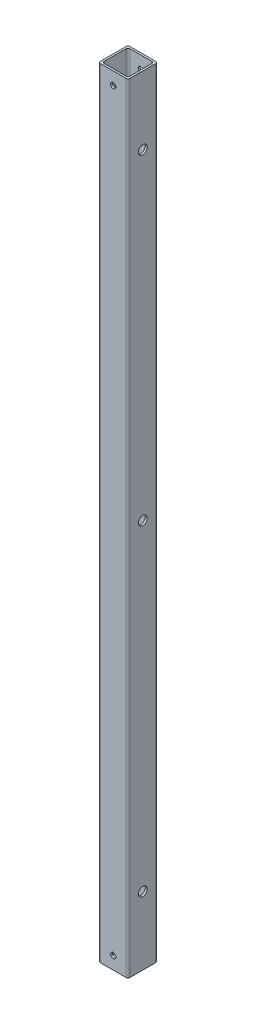
ISO-10303-21;
HEADER;
FILE_DESCRIPTION(('STEP AP214'),'2;1');
FILE_NAME('part.step','',(''),(''),'','','');
FILE_SCHEMA(('AUTOMOTIVE_DESIGN { 1 0 10303 214 1 1 1 1 }'));
ENDSEC;
DATA;
#1=APPLICATION_CONTEXT('core data for automotive mechanical design processes');
#2=APPLICATION_PROTOCOL_DEFINITION('international standard','automotive_design',2000,#1);
#3=PRODUCT_CONTEXT('',#1,'mechanical');
#4=PRODUCT('Part','Part','',(#3));
#5=PRODUCT_RELATED_PRODUCT_CATEGORY('part','',(#4));
#6=PRODUCT_DEFINITION_FORMATION('','',#4);
#7=PRODUCT_DEFINITION_CONTEXT('part definition',#1,'design');
#8=PRODUCT_DEFINITION('design','',#6,#7);
#9=PRODUCT_DEFINITION_SHAPE('','',#8);
#10=(LENGTH_UNIT() NAMED_UNIT(*) SI_UNIT(.MILLI.,.METRE.));
#11=(NAMED_UNIT(*) PLANE_ANGLE_UNIT() SI_UNIT($,.RADIAN.));
#12=(NAMED_UNIT(*) SI_UNIT($,.STERADIAN.) SOLID_ANGLE_UNIT());
#13=UNCERTAINTY_MEASURE_WITH_UNIT(LENGTH_MEASURE(1.E-05),#10,'distance_accuracy_value','');
#14=(GEOMETRIC_REPRESENTATION_CONTEXT(3) GLOBAL_UNCERTAINTY_ASSIGNED_CONTEXT((#13)) GLOBAL_UNIT_ASSIGNED_CONTEXT((#10,
#11,#12)) REPRESENTATION_CONTEXT('',''));
#15=CARTESIAN_POINT('',(0.,0.,0.));
#16=DIRECTION('',(0.,0.,1.));
#17=DIRECTION('',(1.,0.,0.));
#18=AXIS2_PLACEMENT_3D('',#15,#16,#17);
#19=CARTESIAN_POINT('',(0.,508.,0.));
#20=DIRECTION('',(0.,-1.,0.));
#21=DIRECTION('',(0.,0.,-1.));
#22=AXIS2_PLACEMENT_3D('',#19,#20,#21);
#23=PLANE('',#22);
#24=DIRECTION('',(0.,0.,1.));
#25=VECTOR('',#24,1.);
#26=CARTESIAN_POINT('',(-9.652,508.,9.652));
#27=LINE('',#26,#25);
#28=CARTESIAN_POINT('',(-9.652,508.,-8.382));
#29=VERTEX_POINT('',#28);
#30=CARTESIAN_POINT('',(-9.652,508.,8.382));
#31=VERTEX_POINT('',#30);
#32=EDGE_CURVE('E180',#29,#31,#27,.T.);
#33=ORIENTED_EDGE('',*,*,#32,.T.);
#34=CARTESIAN_POINT('',(-8.382,508.,8.382));
#35=DIRECTION('',(0.,-1.,0.));
#36=DIRECTION('',(0.,0.,-1.));
#37=AXIS2_PLACEMENT_3D('',#34,#35,#36);
#38=CIRCLE('',#37,1.27);
#39=CARTESIAN_POINT('',(-8.382,508.,9.652));
#40=VERTEX_POINT('',#39);
#41=EDGE_CURVE('E222',#31,#40,#38,.F.);
#42=ORIENTED_EDGE('',*,*,#41,.T.);
#43=DIRECTION('',(1.,0.,0.));
#44=VECTOR('',#43,1.);
#45=CARTESIAN_POINT('',(-9.652,508.,9.652));
#46=LINE('',#45,#44);
#47=CARTESIAN_POINT('',(8.382,508.,9.652));
#48=VERTEX_POINT('',#47);
#49=EDGE_CURVE('E175',#40,#48,#46,.T.);
#50=ORIENTED_EDGE('',*,*,#49,.T.);
#51=CARTESIAN_POINT('',(8.382,508.,8.382));
#52=DIRECTION('',(0.,-1.,0.));
#53=DIRECTION('',(0.,0.,-1.));
#54=AXIS2_PLACEMENT_3D('',#51,#52,#53);
#55=CIRCLE('',#54,1.27);
#56=CARTESIAN_POINT('',(9.652,508.,8.382));
#57=VERTEX_POINT('',#56);
#58=EDGE_CURVE('E217',#48,#57,#55,.F.);
#59=ORIENTED_EDGE('',*,*,#58,.T.);
#60=DIRECTION('',(0.,0.,-1.));
#61=VECTOR('',#60,1.);
#62=CARTESIAN_POINT('',(9.652,508.,9.652));
#63=LINE('',#62,#61);
#64=CARTESIAN_POINT('',(9.652,508.,-8.382));
#65=VERTEX_POINT('',#64);
#66=EDGE_CURVE('E313',#57,#65,#63,.T.);
#67=ORIENTED_EDGE('',*,*,#66,.T.);
#68=CARTESIAN_POINT('',(8.382,508.,-8.382));
#69=DIRECTION('',(0.,-1.,0.));
#70=DIRECTION('',(0.,0.,-1.));
#71=AXIS2_PLACEMENT_3D('',#68,#69,#70);
#72=CIRCLE('',#71,1.27);
#73=CARTESIAN_POINT('',(8.382,508.,-9.652));
#74=VERTEX_POINT('',#73);
#75=EDGE_CURVE('E58',#65,#74,#72,.F.);
#76=ORIENTED_EDGE('',*,*,#75,.T.);
#77=DIRECTION('',(-1.,0.,0.));
#78=VECTOR('',#77,1.);
#79=CARTESIAN_POINT('',(-9.652,508.,-9.652));
#80=LINE('',#79,#78);
#81=CARTESIAN_POINT('',(-8.382,508.,-9.652));
#82=VERTEX_POINT('',#81);
#83=EDGE_CURVE('E315',#74,#82,#80,.T.);
#84=ORIENTED_EDGE('',*,*,#83,.T.);
#85=CARTESIAN_POINT('',(-8.382,508.,-8.382));
#86=DIRECTION('',(0.,-1.,0.));
#87=DIRECTION('',(0.,0.,-1.));
#88=AXIS2_PLACEMENT_3D('',#85,#86,#87);
#89=CIRCLE('',#88,1.27);
#90=EDGE_CURVE('E220',#82,#29,#89,.F.);
#91=ORIENTED_EDGE('',*,*,#90,.T.);
#92=EDGE_LOOP('',(#33,#42,#50,#59,#67,#76,#84,#91));
#93=FACE_BOUND('',#92,.T.);
#94=DIRECTION('',(1.,0.,0.));
#95=VECTOR('',#94,1.);
#96=CARTESIAN_POINT('',(-8.382,508.,8.382));
#97=LINE('',#96,#95);
#98=CARTESIAN_POINT('',(-7.112,508.,8.382));
#99=VERTEX_POINT('',#98);
#100=CARTESIAN_POINT('',(7.112,508.,8.382));
#101=VERTEX_POINT('',#100);
#102=EDGE_CURVE('E296',#99,#101,#97,.T.);
#103=ORIENTED_EDGE('',*,*,#102,.F.);
#104=CARTESIAN_POINT('',(-7.112,508.,7.112));
#105=DIRECTION('',(0.,-1.,0.));
#106=DIRECTION('',(0.,0.,-1.));
#107=AXIS2_PLACEMENT_3D('',#104,#105,#106);
#108=CIRCLE('',#107,1.27);
#109=CARTESIAN_POINT('',(-8.382,508.,7.112));
#110=VERTEX_POINT('',#109);
#111=EDGE_CURVE('E11',#99,#110,#108,.T.);
#112=ORIENTED_EDGE('',*,*,#111,.T.);
#113=DIRECTION('',(0.,0.,1.));
#114=VECTOR('',#113,1.);
#115=CARTESIAN_POINT('',(-8.382,508.,8.382));
#116=LINE('',#115,#114);
#117=CARTESIAN_POINT('',(-8.382,508.,-7.11199999999999));
#118=VERTEX_POINT('',#117);
#119=EDGE_CURVE('E304',#118,#110,#116,.T.);
#120=ORIENTED_EDGE('',*,*,#119,.F.);
#121=CARTESIAN_POINT('',(-7.112,508.,-7.112));
#122=DIRECTION('',(0.,-1.,0.));
#123=DIRECTION('',(0.,0.,-1.));
#124=AXIS2_PLACEMENT_3D('',#121,#122,#123);
#125=CIRCLE('',#124,1.27);
#126=CARTESIAN_POINT('',(-7.112,508.,-8.382));
#127=VERTEX_POINT('',#126);
#128=EDGE_CURVE('E235',#118,#127,#125,.T.);
#129=ORIENTED_EDGE('',*,*,#128,.T.);
#130=DIRECTION('',(-1.,0.,0.));
#131=VECTOR('',#130,1.);
#132=CARTESIAN_POINT('',(-8.382,508.,-8.382));
#133=LINE('',#132,#131);
#134=CARTESIAN_POINT('',(7.112,508.,-8.382));
#135=VERTEX_POINT('',#134);
#136=EDGE_CURVE('E302',#135,#127,#133,.T.);
#137=ORIENTED_EDGE('',*,*,#136,.F.);
#138=CARTESIAN_POINT('',(7.112,508.,-7.112));
#139=DIRECTION('',(0.,-1.,0.));
#140=DIRECTION('',(0.,0.,-1.));
#141=AXIS2_PLACEMENT_3D('',#138,#139,#140);
#142=CIRCLE('',#141,1.27);
#143=CARTESIAN_POINT('',(8.382,508.,-7.11199999999999));
#144=VERTEX_POINT('',#143);
#145=EDGE_CURVE('E160',#135,#144,#142,.T.);
#146=ORIENTED_EDGE('',*,*,#145,.T.);
#147=DIRECTION('',(0.,0.,-1.));
#148=VECTOR('',#147,1.);
#149=CARTESIAN_POINT('',(8.382,508.,8.382));
#150=LINE('',#149,#148);
#151=CARTESIAN_POINT('',(8.382,508.,7.112));
#152=VERTEX_POINT('',#151);
#153=EDGE_CURVE('E299',#152,#144,#150,.T.);
#154=ORIENTED_EDGE('',*,*,#153,.F.);
#155=CARTESIAN_POINT('',(7.112,508.,7.112));
#156=DIRECTION('',(0.,-1.,0.));
#157=DIRECTION('',(0.,0.,-1.));
#158=AXIS2_PLACEMENT_3D('',#155,#156,#157);
#159=CIRCLE('',#158,1.27);
#160=EDGE_CURVE('E161',#152,#101,#159,.T.);
#161=ORIENTED_EDGE('',*,*,#160,.T.);
#162=EDGE_LOOP('',(#103,#112,#120,#129,#137,#146,#154,#161));
#163=FACE_BOUND('',#162,.T.);
#164=ADVANCED_FACE('F34',(#93,#163),#23,.F.);
#165=CARTESIAN_POINT('',(0.,0.,0.));
#166=DIRECTION('',(0.,-1.,0.));
#167=DIRECTION('',(0.,0.,-1.));
#168=AXIS2_PLACEMENT_3D('',#165,#166,#167);
#169=PLANE('',#168);
#170=DIRECTION('',(1.,0.,0.));
#171=VECTOR('',#170,1.);
#172=CARTESIAN_POINT('',(-9.652,0.,9.652));
#173=LINE('',#172,#171);
#174=CARTESIAN_POINT('',(-8.382,0.,9.652));
#175=VERTEX_POINT('',#174);
#176=CARTESIAN_POINT('',(8.382,0.,9.652));
#177=VERTEX_POINT('',#176);
#178=EDGE_CURVE('E183',#175,#177,#173,.T.);
#179=ORIENTED_EDGE('',*,*,#178,.F.);
#180=CARTESIAN_POINT('',(-8.382,0.,8.382));
#181=DIRECTION('',(0.,-1.,0.));
#182=DIRECTION('',(0.,0.,-1.));
#183=AXIS2_PLACEMENT_3D('',#180,#181,#182);
#184=CIRCLE('',#183,1.27);
#185=CARTESIAN_POINT('',(-9.652,0.,8.382));
#186=VERTEX_POINT('',#185);
#187=EDGE_CURVE('E210',#175,#186,#184,.T.);
#188=ORIENTED_EDGE('',*,*,#187,.T.);
#189=DIRECTION('',(0.,0.,1.));
#190=VECTOR('',#189,1.);
#191=CARTESIAN_POINT('',(-9.652,0.,9.652));
#192=LINE('',#191,#190);
#193=CARTESIAN_POINT('',(-9.652,0.,-8.382));
#194=VERTEX_POINT('',#193);
#195=EDGE_CURVE('E322',#194,#186,#192,.T.);
#196=ORIENTED_EDGE('',*,*,#195,.F.);
#197=CARTESIAN_POINT('',(-8.382,0.,-8.382));
#198=DIRECTION('',(0.,-1.,0.));
#199=DIRECTION('',(0.,0.,-1.));
#200=AXIS2_PLACEMENT_3D('',#197,#198,#199);
#201=CIRCLE('',#200,1.27);
#202=CARTESIAN_POINT('',(-8.382,0.,-9.652));
#203=VERTEX_POINT('',#202);
#204=EDGE_CURVE('E208',#194,#203,#201,.T.);
#205=ORIENTED_EDGE('',*,*,#204,.T.);
#206=DIRECTION('',(-1.,0.,0.));
#207=VECTOR('',#206,1.);
#208=CARTESIAN_POINT('',(-9.652,0.,-9.652));
#209=LINE('',#208,#207);
#210=CARTESIAN_POINT('',(8.382,0.,-9.652));
#211=VERTEX_POINT('',#210);
#212=EDGE_CURVE('E321',#211,#203,#209,.T.);
#213=ORIENTED_EDGE('',*,*,#212,.F.);
#214=CARTESIAN_POINT('',(8.382,0.,-8.382));
#215=DIRECTION('',(0.,-1.,0.));
#216=DIRECTION('',(0.,0.,-1.));
#217=AXIS2_PLACEMENT_3D('',#214,#215,#216);
#218=CIRCLE('',#217,1.27);
#219=CARTESIAN_POINT('',(9.652,0.,-8.382));
#220=VERTEX_POINT('',#219);
#221=EDGE_CURVE('E206',#211,#220,#218,.T.);
#222=ORIENTED_EDGE('',*,*,#221,.T.);
#223=DIRECTION('',(0.,0.,-1.));
#224=VECTOR('',#223,1.);
#225=CARTESIAN_POINT('',(9.652,0.,9.652));
#226=LINE('',#225,#224);
#227=CARTESIAN_POINT('',(9.652,0.,8.382));
#228=VERTEX_POINT('',#227);
#229=EDGE_CURVE('E307',#228,#220,#226,.T.);
#230=ORIENTED_EDGE('',*,*,#229,.F.);
#231=CARTESIAN_POINT('',(8.382,0.,8.382));
#232=DIRECTION('',(0.,-1.,0.));
#233=DIRECTION('',(0.,0.,-1.));
#234=AXIS2_PLACEMENT_3D('',#231,#232,#233);
#235=CIRCLE('',#234,1.27);
#236=EDGE_CURVE('E204',#228,#177,#235,.T.);
#237=ORIENTED_EDGE('',*,*,#236,.T.);
#238=EDGE_LOOP('',(#179,#188,#196,#205,#213,#222,#230,#237));
#239=FACE_BOUND('',#238,.T.);
#240=DIRECTION('',(-1.,0.,0.));
#241=VECTOR('',#240,1.);
#242=CARTESIAN_POINT('',(-8.382,0.,-8.382));
#243=LINE('',#242,#241);
#244=CARTESIAN_POINT('',(7.112,0.,-8.382));
#245=VERTEX_POINT('',#244);
#246=CARTESIAN_POINT('',(-7.112,0.,-8.382));
#247=VERTEX_POINT('',#246);
#248=EDGE_CURVE('E153',#245,#247,#243,.T.);
#249=ORIENTED_EDGE('',*,*,#248,.T.);
#250=CARTESIAN_POINT('',(-7.112,0.,-7.112));
#251=DIRECTION('',(0.,-1.,0.));
#252=DIRECTION('',(0.,0.,-1.));
#253=AXIS2_PLACEMENT_3D('',#250,#251,#252);
#254=CIRCLE('',#253,1.27);
#255=CARTESIAN_POINT('',(-8.382,0.,-7.11199999999999));
#256=VERTEX_POINT('',#255);
#257=EDGE_CURVE('E233',#247,#256,#254,.F.);
#258=ORIENTED_EDGE('',*,*,#257,.T.);
#259=DIRECTION('',(0.,0.,1.));
#260=VECTOR('',#259,1.);
#261=CARTESIAN_POINT('',(-8.382,0.,8.382));
#262=LINE('',#261,#260);
#263=CARTESIAN_POINT('',(-8.382,0.,7.112));
#264=VERTEX_POINT('',#263);
#265=EDGE_CURVE('E171',#256,#264,#262,.T.);
#266=ORIENTED_EDGE('',*,*,#265,.T.);
#267=CARTESIAN_POINT('',(-7.112,0.,7.112));
#268=DIRECTION('',(0.,-1.,0.));
#269=DIRECTION('',(0.,0.,-1.));
#270=AXIS2_PLACEMENT_3D('',#267,#268,#269);
#271=CIRCLE('',#270,1.27);
#272=CARTESIAN_POINT('',(-7.112,0.,8.382));
#273=VERTEX_POINT('',#272);
#274=EDGE_CURVE('E43',#264,#273,#271,.F.);
#275=ORIENTED_EDGE('',*,*,#274,.T.);
#276=DIRECTION('',(1.,0.,0.));
#277=VECTOR('',#276,1.);
#278=CARTESIAN_POINT('',(-8.382,0.,8.382));
#279=LINE('',#278,#277);
#280=CARTESIAN_POINT('',(7.112,0.,8.382));
#281=VERTEX_POINT('',#280);
#282=EDGE_CURVE('E295',#273,#281,#279,.T.);
#283=ORIENTED_EDGE('',*,*,#282,.T.);
#284=CARTESIAN_POINT('',(7.112,0.,7.112));
#285=DIRECTION('',(0.,-1.,0.));
#286=DIRECTION('',(0.,0.,-1.));
#287=AXIS2_PLACEMENT_3D('',#284,#285,#286);
#288=CIRCLE('',#287,1.27);
#289=CARTESIAN_POINT('',(8.382,0.,7.112));
#290=VERTEX_POINT('',#289);
#291=EDGE_CURVE('E237',#281,#290,#288,.F.);
#292=ORIENTED_EDGE('',*,*,#291,.T.);
#293=DIRECTION('',(0.,0.,-1.));
#294=VECTOR('',#293,1.);
#295=CARTESIAN_POINT('',(8.382,0.,8.382));
#296=LINE('',#295,#294);
#297=CARTESIAN_POINT('',(8.382,0.,-7.11199999999999));
#298=VERTEX_POINT('',#297);
#299=EDGE_CURVE('E155',#290,#298,#296,.T.);
#300=ORIENTED_EDGE('',*,*,#299,.T.);
#301=CARTESIAN_POINT('',(7.112,0.,-7.112));
#302=DIRECTION('',(0.,-1.,0.));
#303=DIRECTION('',(0.,0.,-1.));
#304=AXIS2_PLACEMENT_3D('',#301,#302,#303);
#305=CIRCLE('',#304,1.27);
#306=EDGE_CURVE('E150',#298,#245,#305,.F.);
#307=ORIENTED_EDGE('',*,*,#306,.T.);
#308=EDGE_LOOP('',(#249,#258,#266,#275,#283,#292,#300,#307));
#309=FACE_BOUND('',#308,.T.);
#310=ADVANCED_FACE('F152',(#239,#309),#169,.T.);
#311=CARTESIAN_POINT('',(9.652,508.,9.652));
#312=DIRECTION('',(-1.,0.,0.));
#313=DIRECTION('',(0.,0.,1.));
#314=AXIS2_PLACEMENT_3D('',#311,#312,#313);
#315=PLANE('',#314);
#316=CARTESIAN_POINT('',(9.652,44.45,0.));
#317=DIRECTION('',(-1.,0.,0.));
#318=DIRECTION('',(0.,0.,1.));
#319=AXIS2_PLACEMENT_3D('',#316,#317,#318);
#320=CIRCLE('',#319,2.8956);
#321=CARTESIAN_POINT('',(9.652,44.45,2.8956));
#322=VERTEX_POINT('',#321);
#323=EDGE_CURVE('E255',#322,#322,#320,.T.);
#324=ORIENTED_EDGE('',*,*,#323,.T.);
#325=EDGE_LOOP('',(#324));
#326=FACE_BOUND('',#325,.T.);
#327=CARTESIAN_POINT('',(9.652,254.,0.));
#328=DIRECTION('',(-1.,0.,0.));
#329=DIRECTION('',(0.,0.,1.));
#330=AXIS2_PLACEMENT_3D('',#327,#328,#329);
#331=CIRCLE('',#330,2.8956);
#332=CARTESIAN_POINT('',(9.652,254.,2.8956));
#333=VERTEX_POINT('',#332);
#334=EDGE_CURVE('E251',#333,#333,#331,.T.);
#335=ORIENTED_EDGE('',*,*,#334,.T.);
#336=EDGE_LOOP('',(#335));
#337=FACE_BOUND('',#336,.T.);
#338=CARTESIAN_POINT('',(9.652,463.55,0.));
#339=DIRECTION('',(-1.,0.,0.));
#340=DIRECTION('',(0.,0.,1.));
#341=AXIS2_PLACEMENT_3D('',#338,#339,#340);
#342=CIRCLE('',#341,2.8956);
#343=CARTESIAN_POINT('',(9.652,463.55,2.8956));
#344=VERTEX_POINT('',#343);
#345=EDGE_CURVE('E246',#344,#344,#342,.T.);
#346=ORIENTED_EDGE('',*,*,#345,.T.);
#347=EDGE_LOOP('',(#346));
#348=FACE_BOUND('',#347,.T.);
#349=ORIENTED_EDGE('',*,*,#229,.T.);
#350=DIRECTION('',(0.,-1.,0.));
#351=VECTOR('',#350,1.);
#352=CARTESIAN_POINT('',(9.652,508.,-8.382));
#353=LINE('',#352,#351);
#354=EDGE_CURVE('E231',#220,#65,#353,.F.);
#355=ORIENTED_EDGE('',*,*,#354,.T.);
#356=ORIENTED_EDGE('',*,*,#66,.F.);
#357=DIRECTION('',(0.,-1.,0.));
#358=VECTOR('',#357,1.);
#359=CARTESIAN_POINT('',(9.652,508.,8.382));
#360=LINE('',#359,#358);
#361=EDGE_CURVE('E228',#57,#228,#360,.T.);
#362=ORIENTED_EDGE('',*,*,#361,.T.);
#363=EDGE_LOOP('',(#349,#355,#356,#362));
#364=FACE_BOUND('',#363,.T.);
#365=ADVANCED_FACE('F341',(#326,#337,#348,#364),#315,.F.);
#366=CARTESIAN_POINT('',(-9.652,508.,-9.652));
#367=DIRECTION('',(0.,0.,1.));
#368=DIRECTION('',(1.,0.,0.));
#369=AXIS2_PLACEMENT_3D('',#366,#367,#368);
#370=PLANE('',#369);
#371=CARTESIAN_POINT('',(0.,499.745,-9.652));
#372=DIRECTION('',(0.,0.,1.));
#373=DIRECTION('',(1.,0.,0.));
#374=AXIS2_PLACEMENT_3D('',#371,#372,#373);
#375=CIRCLE('',#374,1.7272);
#376=CARTESIAN_POINT('',(1.72720000000006,499.745,-9.652));
#377=VERTEX_POINT('',#376);
#378=EDGE_CURVE('E691',#377,#377,#375,.T.);
#379=ORIENTED_EDGE('',*,*,#378,.T.);
#380=EDGE_LOOP('',(#379));
#381=FACE_BOUND('',#380,.T.);
#382=CARTESIAN_POINT('',(0.,8.255,-9.652));
#383=DIRECTION('',(0.,0.,1.));
#384=DIRECTION('',(1.,0.,0.));
#385=AXIS2_PLACEMENT_3D('',#382,#383,#384);
#386=CIRCLE('',#385,1.7272);
#387=CARTESIAN_POINT('',(1.72720000000006,8.255,-9.652));
#388=VERTEX_POINT('',#387);
#389=EDGE_CURVE('E259',#388,#388,#386,.T.);
#390=ORIENTED_EDGE('',*,*,#389,.T.);
#391=EDGE_LOOP('',(#390));
#392=FACE_BOUND('',#391,.T.);
#393=ORIENTED_EDGE('',*,*,#212,.T.);
#394=DIRECTION('',(0.,-1.,0.));
#395=VECTOR('',#394,1.);
#396=CARTESIAN_POINT('',(-8.382,508.,-9.652));
#397=LINE('',#396,#395);
#398=EDGE_CURVE('E51',#203,#82,#397,.F.);
#399=ORIENTED_EDGE('',*,*,#398,.T.);
#400=ORIENTED_EDGE('',*,*,#83,.F.);
#401=DIRECTION('',(0.,-1.,0.));
#402=VECTOR('',#401,1.);
#403=CARTESIAN_POINT('',(8.382,508.,-9.652));
#404=LINE('',#403,#402);
#405=EDGE_CURVE('E224',#74,#211,#404,.T.);
#406=ORIENTED_EDGE('',*,*,#405,.T.);
#407=EDGE_LOOP('',(#393,#399,#400,#406));
#408=FACE_BOUND('',#407,.T.);
#409=ADVANCED_FACE('F348',(#381,#392,#408),#370,.F.);
#410=CARTESIAN_POINT('',(-9.652,508.,9.652));
#411=DIRECTION('',(1.,0.,0.));
#412=DIRECTION('',(0.,0.,-1.));
#413=AXIS2_PLACEMENT_3D('',#410,#411,#412);
#414=PLANE('',#413);
#415=CARTESIAN_POINT('',(-9.652,44.45,0.));
#416=DIRECTION('',(-1.,0.,0.));
#417=DIRECTION('',(0.,0.,1.));
#418=AXIS2_PLACEMENT_3D('',#415,#416,#417);
#419=CIRCLE('',#418,2.89559999999998);
#420=CARTESIAN_POINT('',(-9.652,44.45,2.89559999999998));
#421=VERTEX_POINT('',#420);
#422=EDGE_CURVE('E263',#421,#421,#419,.T.);
#423=ORIENTED_EDGE('',*,*,#422,.F.);
#424=EDGE_LOOP('',(#423));
#425=FACE_BOUND('',#424,.T.);
#426=CARTESIAN_POINT('',(-9.652,254.,0.));
#427=DIRECTION('',(-1.,0.,0.));
#428=DIRECTION('',(0.,0.,1.));
#429=AXIS2_PLACEMENT_3D('',#426,#427,#428);
#430=CIRCLE('',#429,2.8956);
#431=CARTESIAN_POINT('',(-9.652,254.,2.8956));
#432=VERTEX_POINT('',#431);
#433=EDGE_CURVE('E281',#432,#432,#430,.T.);
#434=ORIENTED_EDGE('',*,*,#433,.F.);
#435=EDGE_LOOP('',(#434));
#436=FACE_BOUND('',#435,.T.);
#437=CARTESIAN_POINT('',(-9.652,463.55,0.));
#438=DIRECTION('',(-1.,0.,0.));
#439=DIRECTION('',(0.,0.,1.));
#440=AXIS2_PLACEMENT_3D('',#437,#438,#439);
#441=CIRCLE('',#440,2.8956);
#442=CARTESIAN_POINT('',(-9.652,463.55,2.8956));
#443=VERTEX_POINT('',#442);
#444=EDGE_CURVE('E288',#443,#443,#441,.T.);
#445=ORIENTED_EDGE('',*,*,#444,.F.);
#446=EDGE_LOOP('',(#445));
#447=FACE_BOUND('',#446,.T.);
#448=ORIENTED_EDGE('',*,*,#195,.T.);
#449=DIRECTION('',(0.,-1.,0.));
#450=VECTOR('',#449,1.);
#451=CARTESIAN_POINT('',(-9.652,508.,8.382));
#452=LINE('',#451,#450);
#453=EDGE_CURVE('E215',#186,#31,#452,.F.);
#454=ORIENTED_EDGE('',*,*,#453,.T.);
#455=ORIENTED_EDGE('',*,*,#32,.F.);
#456=DIRECTION('',(0.,-1.,0.));
#457=VECTOR('',#456,1.);
#458=CARTESIAN_POINT('',(-9.652,508.,-8.382));
#459=LINE('',#458,#457);
#460=EDGE_CURVE('E212',#29,#194,#459,.T.);
#461=ORIENTED_EDGE('',*,*,#460,.T.);
#462=EDGE_LOOP('',(#448,#454,#455,#461));
#463=FACE_BOUND('',#462,.T.);
#464=ADVANCED_FACE('F354',(#425,#436,#447,#463),#414,.F.);
#465=CARTESIAN_POINT('',(-9.652,508.,9.652));
#466=DIRECTION('',(0.,0.,-1.));
#467=DIRECTION('',(-1.,0.,0.));
#468=AXIS2_PLACEMENT_3D('',#465,#466,#467);
#469=PLANE('',#468);
#470=CARTESIAN_POINT('',(0.,499.745,9.652));
#471=DIRECTION('',(0.,0.,1.));
#472=DIRECTION('',(1.,0.,0.));
#473=AXIS2_PLACEMENT_3D('',#470,#471,#472);
#474=CIRCLE('',#473,1.7272);
#475=CARTESIAN_POINT('',(1.72720000000006,499.745,9.652));
#476=VERTEX_POINT('',#475);
#477=EDGE_CURVE('E695',#476,#476,#474,.T.);
#478=ORIENTED_EDGE('',*,*,#477,.F.);
#479=EDGE_LOOP('',(#478));
#480=FACE_BOUND('',#479,.T.);
#481=CARTESIAN_POINT('',(0.,8.255,9.652));
#482=DIRECTION('',(0.,0.,1.));
#483=DIRECTION('',(1.,0.,0.));
#484=AXIS2_PLACEMENT_3D('',#481,#482,#483);
#485=CIRCLE('',#484,1.7272);
#486=CARTESIAN_POINT('',(1.72720000000006,8.255,9.652));
#487=VERTEX_POINT('',#486);
#488=EDGE_CURVE('E266',#487,#487,#485,.T.);
#489=ORIENTED_EDGE('',*,*,#488,.F.);
#490=EDGE_LOOP('',(#489));
#491=FACE_BOUND('',#490,.T.);
#492=ORIENTED_EDGE('',*,*,#49,.F.);
#493=DIRECTION('',(0.,-1.,0.));
#494=VECTOR('',#493,1.);
#495=CARTESIAN_POINT('',(-8.382,508.,9.652));
#496=LINE('',#495,#494);
#497=EDGE_CURVE('E201',#40,#175,#496,.T.);
#498=ORIENTED_EDGE('',*,*,#497,.T.);
#499=ORIENTED_EDGE('',*,*,#178,.T.);
#500=DIRECTION('',(0.,-1.,0.));
#501=VECTOR('',#500,1.);
#502=CARTESIAN_POINT('',(8.382,508.,9.652));
#503=LINE('',#502,#501);
#504=EDGE_CURVE('E199',#177,#48,#503,.F.);
#505=ORIENTED_EDGE('',*,*,#504,.T.);
#506=EDGE_LOOP('',(#492,#498,#499,#505));
#507=FACE_BOUND('',#506,.T.);
#508=ADVANCED_FACE('F332',(#480,#491,#507),#469,.F.);
#509=CARTESIAN_POINT('',(-8.382,508.,8.382));
#510=DIRECTION('',(0.,0.,-1.));
#511=DIRECTION('',(-1.,0.,0.));
#512=AXIS2_PLACEMENT_3D('',#509,#510,#511);
#513=PLANE('',#512);
#514=CARTESIAN_POINT('',(0.,499.745,8.382));
#515=DIRECTION('',(0.,0.,-1.));
#516=DIRECTION('',(-1.,0.,0.));
#517=AXIS2_PLACEMENT_3D('',#514,#515,#516);
#518=CIRCLE('',#517,1.7272);
#519=CARTESIAN_POINT('',(-1.72719999999993,499.745,8.382));
#520=VERTEX_POINT('',#519);
#521=EDGE_CURVE('E271',#520,#520,#518,.T.);
#522=ORIENTED_EDGE('',*,*,#521,.F.);
#523=EDGE_LOOP('',(#522));
#524=FACE_BOUND('',#523,.T.);
#525=CARTESIAN_POINT('',(0.,8.255,8.382));
#526=DIRECTION('',(0.,0.,-1.));
#527=DIRECTION('',(-1.,0.,0.));
#528=AXIS2_PLACEMENT_3D('',#525,#526,#527);
#529=CIRCLE('',#528,1.7272);
#530=CARTESIAN_POINT('',(-1.72719999999993,8.255,8.382));
#531=VERTEX_POINT('',#530);
#532=EDGE_CURVE('E258',#531,#531,#529,.T.);
#533=ORIENTED_EDGE('',*,*,#532,.F.);
#534=EDGE_LOOP('',(#533));
#535=FACE_BOUND('',#534,.T.);
#536=ORIENTED_EDGE('',*,*,#102,.T.);
#537=DIRECTION('',(0.,-1.,0.));
#538=VECTOR('',#537,1.);
#539=CARTESIAN_POINT('',(7.112,0.,8.382));
#540=LINE('',#539,#538);
#541=EDGE_CURVE('E192',#101,#281,#540,.T.);
#542=ORIENTED_EDGE('',*,*,#541,.T.);
#543=ORIENTED_EDGE('',*,*,#282,.F.);
#544=DIRECTION('',(0.,-1.,0.));
#545=VECTOR('',#544,1.);
#546=CARTESIAN_POINT('',(-7.112,508.,8.382));
#547=LINE('',#546,#545);
#548=EDGE_CURVE('E190',#273,#99,#547,.F.);
#549=ORIENTED_EDGE('',*,*,#548,.T.);
#550=EDGE_LOOP('',(#536,#542,#543,#549));
#551=FACE_BOUND('',#550,.T.);
#552=ADVANCED_FACE('F375',(#524,#535,#551),#513,.T.);
#553=CARTESIAN_POINT('',(8.382,508.,8.382));
#554=DIRECTION('',(-1.,0.,0.));
#555=DIRECTION('',(0.,0.,1.));
#556=AXIS2_PLACEMENT_3D('',#553,#554,#555);
#557=PLANE('',#556);
#558=CARTESIAN_POINT('',(8.382,44.45,0.));
#559=DIRECTION('',(-1.,0.,0.));
#560=DIRECTION('',(0.,0.,1.));
#561=AXIS2_PLACEMENT_3D('',#558,#559,#560);
#562=CIRCLE('',#561,2.89559999999999);
#563=CARTESIAN_POINT('',(8.382,44.45,2.89559999999999));
#564=VERTEX_POINT('',#563);
#565=EDGE_CURVE('E254',#564,#564,#562,.T.);
#566=ORIENTED_EDGE('',*,*,#565,.F.);
#567=EDGE_LOOP('',(#566));
#568=FACE_BOUND('',#567,.T.);
#569=CARTESIAN_POINT('',(8.382,254.,0.));
#570=DIRECTION('',(-1.,0.,0.));
#571=DIRECTION('',(0.,0.,1.));
#572=AXIS2_PLACEMENT_3D('',#569,#570,#571);
#573=CIRCLE('',#572,2.8956);
#574=CARTESIAN_POINT('',(8.382,254.,2.8956));
#575=VERTEX_POINT('',#574);
#576=EDGE_CURVE('E250',#575,#575,#573,.T.);
#577=ORIENTED_EDGE('',*,*,#576,.F.);
#578=EDGE_LOOP('',(#577));
#579=FACE_BOUND('',#578,.T.);
#580=CARTESIAN_POINT('',(8.382,463.55,0.));
#581=DIRECTION('',(-1.,0.,0.));
#582=DIRECTION('',(0.,0.,1.));
#583=AXIS2_PLACEMENT_3D('',#580,#581,#582);
#584=CIRCLE('',#583,2.8956);
#585=CARTESIAN_POINT('',(8.382,463.55,2.8956));
#586=VERTEX_POINT('',#585);
#587=EDGE_CURVE('E245',#586,#586,#584,.T.);
#588=ORIENTED_EDGE('',*,*,#587,.F.);
#589=EDGE_LOOP('',(#588));
#590=FACE_BOUND('',#589,.T.);
#591=ORIENTED_EDGE('',*,*,#299,.F.);
#592=DIRECTION('',(0.,-1.,0.));
#593=VECTOR('',#592,1.);
#594=CARTESIAN_POINT('',(8.382,508.,7.112));
#595=LINE('',#594,#593);
#596=EDGE_CURVE('E197',#290,#152,#595,.F.);
#597=ORIENTED_EDGE('',*,*,#596,.T.);
#598=ORIENTED_EDGE('',*,*,#153,.T.);
#599=DIRECTION('',(0.,-1.,0.));
#600=VECTOR('',#599,1.);
#601=CARTESIAN_POINT('',(8.382,0.,-7.112));
#602=LINE('',#601,#600);
#603=EDGE_CURVE('E195',#144,#298,#602,.T.);
#604=ORIENTED_EDGE('',*,*,#603,.T.);
#605=EDGE_LOOP('',(#591,#597,#598,#604));
#606=FACE_BOUND('',#605,.T.);
#607=ADVANCED_FACE('F465',(#568,#579,#590,#606),#557,.T.);
#608=CARTESIAN_POINT('',(-8.382,508.,-8.382));
#609=DIRECTION('',(0.,0.,1.));
#610=DIRECTION('',(1.,0.,0.));
#611=AXIS2_PLACEMENT_3D('',#608,#609,#610);
#612=PLANE('',#611);
#613=CARTESIAN_POINT('',(0.,499.745,-8.382));
#614=DIRECTION('',(0.,0.,1.));
#615=DIRECTION('',(1.,0.,0.));
#616=AXIS2_PLACEMENT_3D('',#613,#614,#615);
#617=CIRCLE('',#616,1.7272);
#618=CARTESIAN_POINT('',(1.72720000000006,499.745,-8.382));
#619=VERTEX_POINT('',#618);
#620=EDGE_CURVE('E38',#619,#619,#617,.T.);
#621=ORIENTED_EDGE('',*,*,#620,.F.);
#622=EDGE_LOOP('',(#621));
#623=FACE_BOUND('',#622,.T.);
#624=CARTESIAN_POINT('',(0.,8.255,-8.382));
#625=DIRECTION('',(0.,0.,1.));
#626=DIRECTION('',(1.,0.,0.));
#627=AXIS2_PLACEMENT_3D('',#624,#625,#626);
#628=CIRCLE('',#627,1.7272);
#629=CARTESIAN_POINT('',(1.72720000000006,8.255,-8.382));
#630=VERTEX_POINT('',#629);
#631=EDGE_CURVE('E256',#630,#630,#628,.T.);
#632=ORIENTED_EDGE('',*,*,#631,.F.);
#633=EDGE_LOOP('',(#632));
#634=FACE_BOUND('',#633,.T.);
#635=ORIENTED_EDGE('',*,*,#136,.T.);
#636=DIRECTION('',(0.,-1.,0.));
#637=VECTOR('',#636,1.);
#638=CARTESIAN_POINT('',(-7.112,0.,-8.382));
#639=LINE('',#638,#637);
#640=EDGE_CURVE('E170',#127,#247,#639,.T.);
#641=ORIENTED_EDGE('',*,*,#640,.T.);
#642=ORIENTED_EDGE('',*,*,#248,.F.);
#643=DIRECTION('',(0.,-1.,0.));
#644=VECTOR('',#643,1.);
#645=CARTESIAN_POINT('',(7.112,508.,-8.382));
#646=LINE('',#645,#644);
#647=EDGE_CURVE('E167',#245,#135,#646,.F.);
#648=ORIENTED_EDGE('',*,*,#647,.T.);
#649=EDGE_LOOP('',(#635,#641,#642,#648));
#650=FACE_BOUND('',#649,.T.);
#651=ADVANCED_FACE('F166',(#623,#634,#650),#612,.T.);
#652=CARTESIAN_POINT('',(-8.382,508.,8.382));
#653=DIRECTION('',(1.,0.,0.));
#654=DIRECTION('',(0.,0.,-1.));
#655=AXIS2_PLACEMENT_3D('',#652,#653,#654);
#656=PLANE('',#655);
#657=CARTESIAN_POINT('',(-8.382,44.45,0.));
#658=DIRECTION('',(1.,0.,0.));
#659=DIRECTION('',(0.,0.,-1.));
#660=AXIS2_PLACEMENT_3D('',#657,#658,#659);
#661=CIRCLE('',#660,2.89559999999999);
#662=CARTESIAN_POINT('',(-8.382,44.45,-2.89559999999999));
#663=VERTEX_POINT('',#662);
#664=EDGE_CURVE('E252',#663,#663,#661,.T.);
#665=ORIENTED_EDGE('',*,*,#664,.F.);
#666=EDGE_LOOP('',(#665));
#667=FACE_BOUND('',#666,.T.);
#668=CARTESIAN_POINT('',(-8.382,254.,0.));
#669=DIRECTION('',(1.,0.,0.));
#670=DIRECTION('',(0.,0.,-1.));
#671=AXIS2_PLACEMENT_3D('',#668,#669,#670);
#672=CIRCLE('',#671,2.8956);
#673=CARTESIAN_POINT('',(-8.382,254.,-2.8956));
#674=VERTEX_POINT('',#673);
#675=EDGE_CURVE('E247',#674,#674,#672,.T.);
#676=ORIENTED_EDGE('',*,*,#675,.F.);
#677=EDGE_LOOP('',(#676));
#678=FACE_BOUND('',#677,.T.);
#679=CARTESIAN_POINT('',(-8.382,463.55,0.));
#680=DIRECTION('',(1.,0.,0.));
#681=DIRECTION('',(0.,0.,-1.));
#682=AXIS2_PLACEMENT_3D('',#679,#680,#681);
#683=CIRCLE('',#682,2.8956);
#684=CARTESIAN_POINT('',(-8.382,463.55,-2.8956));
#685=VERTEX_POINT('',#684);
#686=EDGE_CURVE('E242',#685,#685,#683,.T.);
#687=ORIENTED_EDGE('',*,*,#686,.F.);
#688=EDGE_LOOP('',(#687));
#689=FACE_BOUND('',#688,.T.);
#690=ORIENTED_EDGE('',*,*,#265,.F.);
#691=DIRECTION('',(0.,-1.,0.));
#692=VECTOR('',#691,1.);
#693=CARTESIAN_POINT('',(-8.382,508.,-7.112));
#694=LINE('',#693,#692);
#695=EDGE_CURVE('E188',#256,#118,#694,.F.);
#696=ORIENTED_EDGE('',*,*,#695,.T.);
#697=ORIENTED_EDGE('',*,*,#119,.T.);
#698=DIRECTION('',(0.,-1.,0.));
#699=VECTOR('',#698,1.);
#700=CARTESIAN_POINT('',(-8.382,0.,7.112));
#701=LINE('',#700,#699);
#702=EDGE_CURVE('E177',#110,#264,#701,.T.);
#703=ORIENTED_EDGE('',*,*,#702,.T.);
#704=EDGE_LOOP('',(#690,#696,#697,#703));
#705=FACE_BOUND('',#704,.T.);
#706=ADVANCED_FACE('F394',(#667,#678,#689,#705),#656,.T.);
#707=CARTESIAN_POINT('',(-7.112,508.,-7.112));
#708=DIRECTION('',(0.,1.,0.));
#709=DIRECTION('',(0.,0.,1.));
#710=AXIS2_PLACEMENT_3D('',#707,#708,#709);
#711=CYLINDRICAL_SURFACE('',#710,1.27);
#712=ORIENTED_EDGE('',*,*,#128,.F.);
#713=ORIENTED_EDGE('',*,*,#695,.F.);
#714=ORIENTED_EDGE('',*,*,#257,.F.);
#715=ORIENTED_EDGE('',*,*,#640,.F.);
#716=EDGE_LOOP('',(#712,#713,#714,#715));
#717=FACE_BOUND('',#716,.T.);
#718=ADVANCED_FACE('F390',(#717),#711,.F.);
#719=CARTESIAN_POINT('',(7.112,508.,7.112));
#720=DIRECTION('',(0.,1.,0.));
#721=DIRECTION('',(0.,0.,1.));
#722=AXIS2_PLACEMENT_3D('',#719,#720,#721);
#723=CYLINDRICAL_SURFACE('',#722,1.27);
#724=ORIENTED_EDGE('',*,*,#160,.F.);
#725=ORIENTED_EDGE('',*,*,#596,.F.);
#726=ORIENTED_EDGE('',*,*,#291,.F.);
#727=ORIENTED_EDGE('',*,*,#541,.F.);
#728=EDGE_LOOP('',(#724,#725,#726,#727));
#729=FACE_BOUND('',#728,.T.);
#730=ADVANCED_FACE('F393',(#729),#723,.F.);
#731=CARTESIAN_POINT('',(7.112,508.,-7.112));
#732=DIRECTION('',(0.,1.,0.));
#733=DIRECTION('',(0.,0.,1.));
#734=AXIS2_PLACEMENT_3D('',#731,#732,#733);
#735=CYLINDRICAL_SURFACE('',#734,1.27);
#736=ORIENTED_EDGE('',*,*,#145,.F.);
#737=ORIENTED_EDGE('',*,*,#647,.F.);
#738=ORIENTED_EDGE('',*,*,#306,.F.);
#739=ORIENTED_EDGE('',*,*,#603,.F.);
#740=EDGE_LOOP('',(#736,#737,#738,#739));
#741=FACE_BOUND('',#740,.T.);
#742=ADVANCED_FACE('F174',(#741),#735,.F.);
#743=CARTESIAN_POINT('',(-7.112,508.,7.112));
#744=DIRECTION('',(0.,1.,0.));
#745=DIRECTION('',(0.,0.,1.));
#746=AXIS2_PLACEMENT_3D('',#743,#744,#745);
#747=CYLINDRICAL_SURFACE('',#746,1.27);
#748=ORIENTED_EDGE('',*,*,#111,.F.);
#749=ORIENTED_EDGE('',*,*,#548,.F.);
#750=ORIENTED_EDGE('',*,*,#274,.F.);
#751=ORIENTED_EDGE('',*,*,#702,.F.);
#752=EDGE_LOOP('',(#748,#749,#750,#751));
#753=FACE_BOUND('',#752,.T.);
#754=ADVANCED_FACE('F359',(#753),#747,.F.);
#755=CARTESIAN_POINT('',(-8.382,508.,8.382));
#756=DIRECTION('',(0.,-1.,0.));
#757=DIRECTION('',(0.,0.,-1.));
#758=AXIS2_PLACEMENT_3D('',#755,#756,#757);
#759=CYLINDRICAL_SURFACE('',#758,1.27);
#760=ORIENTED_EDGE('',*,*,#41,.F.);
#761=ORIENTED_EDGE('',*,*,#453,.F.);
#762=ORIENTED_EDGE('',*,*,#187,.F.);
#763=ORIENTED_EDGE('',*,*,#497,.F.);
#764=EDGE_LOOP('',(#760,#761,#762,#763));
#765=FACE_BOUND('',#764,.T.);
#766=ADVANCED_FACE('F357',(#765),#759,.T.);
#767=CARTESIAN_POINT('',(-8.382,508.,-8.382));
#768=DIRECTION('',(0.,-1.,0.));
#769=DIRECTION('',(0.,0.,-1.));
#770=AXIS2_PLACEMENT_3D('',#767,#768,#769);
#771=CYLINDRICAL_SURFACE('',#770,1.27);
#772=ORIENTED_EDGE('',*,*,#90,.F.);
#773=ORIENTED_EDGE('',*,*,#398,.F.);
#774=ORIENTED_EDGE('',*,*,#204,.F.);
#775=ORIENTED_EDGE('',*,*,#460,.F.);
#776=EDGE_LOOP('',(#772,#773,#774,#775));
#777=FACE_BOUND('',#776,.T.);
#778=ADVANCED_FACE('F352',(#777),#771,.T.);
#779=CARTESIAN_POINT('',(8.382,508.,-8.382));
#780=DIRECTION('',(0.,-1.,0.));
#781=DIRECTION('',(0.,0.,-1.));
#782=AXIS2_PLACEMENT_3D('',#779,#780,#781);
#783=CYLINDRICAL_SURFACE('',#782,1.27);
#784=ORIENTED_EDGE('',*,*,#75,.F.);
#785=ORIENTED_EDGE('',*,*,#354,.F.);
#786=ORIENTED_EDGE('',*,*,#221,.F.);
#787=ORIENTED_EDGE('',*,*,#405,.F.);
#788=EDGE_LOOP('',(#784,#785,#786,#787));
#789=FACE_BOUND('',#788,.T.);
#790=ADVANCED_FACE('F345',(#789),#783,.T.);
#791=CARTESIAN_POINT('',(8.382,508.,8.382));
#792=DIRECTION('',(0.,-1.,0.));
#793=DIRECTION('',(0.,0.,-1.));
#794=AXIS2_PLACEMENT_3D('',#791,#792,#793);
#795=CYLINDRICAL_SURFACE('',#794,1.27);
#796=ORIENTED_EDGE('',*,*,#58,.F.);
#797=ORIENTED_EDGE('',*,*,#504,.F.);
#798=ORIENTED_EDGE('',*,*,#236,.F.);
#799=ORIENTED_EDGE('',*,*,#361,.F.);
#800=EDGE_LOOP('',(#796,#797,#798,#799));
#801=FACE_BOUND('',#800,.T.);
#802=ADVANCED_FACE('F36',(#801),#795,.T.);
#803=CARTESIAN_POINT('',(-9.652,463.55,0.));
#804=DIRECTION('',(-1.,0.,0.));
#805=DIRECTION('',(0.,0.,1.));
#806=AXIS2_PLACEMENT_3D('',#803,#804,#805);
#807=CYLINDRICAL_SURFACE('',#806,2.8956);
#808=ORIENTED_EDGE('',*,*,#686,.T.);
#809=EDGE_LOOP('',(#808));
#810=FACE_BOUND('',#809,.T.);
#811=ORIENTED_EDGE('',*,*,#444,.T.);
#812=EDGE_LOOP('',(#811));
#813=FACE_BOUND('',#812,.T.);
#814=ADVANCED_FACE('F434',(#810,#813),#807,.F.);
#815=ORIENTED_EDGE('',*,*,#587,.T.);
#816=EDGE_LOOP('',(#815));
#817=FACE_BOUND('',#816,.T.);
#818=ORIENTED_EDGE('',*,*,#345,.F.);
#819=EDGE_LOOP('',(#818));
#820=FACE_BOUND('',#819,.T.);
#821=ADVANCED_FACE('F476',(#817,#820),#807,.F.);
#822=CARTESIAN_POINT('',(-9.652,254.,0.));
#823=DIRECTION('',(-1.,0.,0.));
#824=DIRECTION('',(0.,0.,1.));
#825=AXIS2_PLACEMENT_3D('',#822,#823,#824);
#826=CYLINDRICAL_SURFACE('',#825,2.8956);
#827=ORIENTED_EDGE('',*,*,#675,.T.);
#828=EDGE_LOOP('',(#827));
#829=FACE_BOUND('',#828,.T.);
#830=ORIENTED_EDGE('',*,*,#433,.T.);
#831=EDGE_LOOP('',(#830));
#832=FACE_BOUND('',#831,.T.);
#833=ADVANCED_FACE('F486',(#829,#832),#826,.F.);
#834=ORIENTED_EDGE('',*,*,#576,.T.);
#835=EDGE_LOOP('',(#834));
#836=FACE_BOUND('',#835,.T.);
#837=ORIENTED_EDGE('',*,*,#334,.F.);
#838=EDGE_LOOP('',(#837));
#839=FACE_BOUND('',#838,.T.);
#840=ADVANCED_FACE('F495',(#836,#839),#826,.F.);
#841=CARTESIAN_POINT('',(-9.652,44.45,0.));
#842=DIRECTION('',(-1.,0.,0.));
#843=DIRECTION('',(0.,0.,1.));
#844=AXIS2_PLACEMENT_3D('',#841,#842,#843);
#845=CYLINDRICAL_SURFACE('',#844,2.89559999999999);
#846=ORIENTED_EDGE('',*,*,#664,.T.);
#847=EDGE_LOOP('',(#846));
#848=FACE_BOUND('',#847,.T.);
#849=ORIENTED_EDGE('',*,*,#422,.T.);
#850=EDGE_LOOP('',(#849));
#851=FACE_BOUND('',#850,.T.);
#852=ADVANCED_FACE('F505',(#848,#851),#845,.F.);
#853=ORIENTED_EDGE('',*,*,#565,.T.);
#854=EDGE_LOOP('',(#853));
#855=FACE_BOUND('',#854,.T.);
#856=ORIENTED_EDGE('',*,*,#323,.F.);
#857=EDGE_LOOP('',(#856));
#858=FACE_BOUND('',#857,.T.);
#859=ADVANCED_FACE('F514',(#855,#858),#845,.F.);
#860=CARTESIAN_POINT('',(0.,8.255,9.652));
#861=DIRECTION('',(0.,0.,1.));
#862=DIRECTION('',(1.,0.,0.));
#863=AXIS2_PLACEMENT_3D('',#860,#861,#862);
#864=CYLINDRICAL_SURFACE('',#863,1.7272);
#865=ORIENTED_EDGE('',*,*,#631,.T.);
#866=EDGE_LOOP('',(#865));
#867=FACE_BOUND('',#866,.T.);
#868=ORIENTED_EDGE('',*,*,#389,.F.);
#869=EDGE_LOOP('',(#868));
#870=FACE_BOUND('',#869,.T.);
#871=ADVANCED_FACE('F524',(#867,#870),#864,.F.);
#872=ORIENTED_EDGE('',*,*,#532,.T.);
#873=EDGE_LOOP('',(#872));
#874=FACE_BOUND('',#873,.T.);
#875=ORIENTED_EDGE('',*,*,#488,.T.);
#876=EDGE_LOOP('',(#875));
#877=FACE_BOUND('',#876,.T.);
#878=ADVANCED_FACE('F534',(#874,#877),#864,.F.);
#879=CARTESIAN_POINT('',(0.,499.745,9.652));
#880=DIRECTION('',(0.,0.,1.));
#881=DIRECTION('',(1.,0.,0.));
#882=AXIS2_PLACEMENT_3D('',#879,#880,#881);
#883=CYLINDRICAL_SURFACE('',#882,1.7272);
#884=ORIENTED_EDGE('',*,*,#620,.T.);
#885=EDGE_LOOP('',(#884));
#886=FACE_BOUND('',#885,.T.);
#887=ORIENTED_EDGE('',*,*,#378,.F.);
#888=EDGE_LOOP('',(#887));
#889=FACE_BOUND('',#888,.T.);
#890=ADVANCED_FACE('F544',(#886,#889),#883,.F.);
#891=ORIENTED_EDGE('',*,*,#521,.T.);
#892=EDGE_LOOP('',(#891));
#893=FACE_BOUND('',#892,.T.);
#894=ORIENTED_EDGE('',*,*,#477,.T.);
#895=EDGE_LOOP('',(#894));
#896=FACE_BOUND('',#895,.T.);
#897=ADVANCED_FACE('F553',(#893,#896),#883,.F.);
#898=CLOSED_SHELL('',(#164,#310,#365,#409,#464,#508,#552,#607,#651,#706,#718,#730,#742,#754,
#766,#778,#790,#802,#814,#821,#833,#840,#852,#859,#871,#878,#890,#897));
#899=MANIFOLD_SOLID_BREP('B2',#898);
#900=ADVANCED_BREP_SHAPE_REPRESENTATION('',(#18,#899),#14);
#901=SHAPE_DEFINITION_REPRESENTATION(#9,#900);
ENDSEC;
END-ISO-10303-21;
